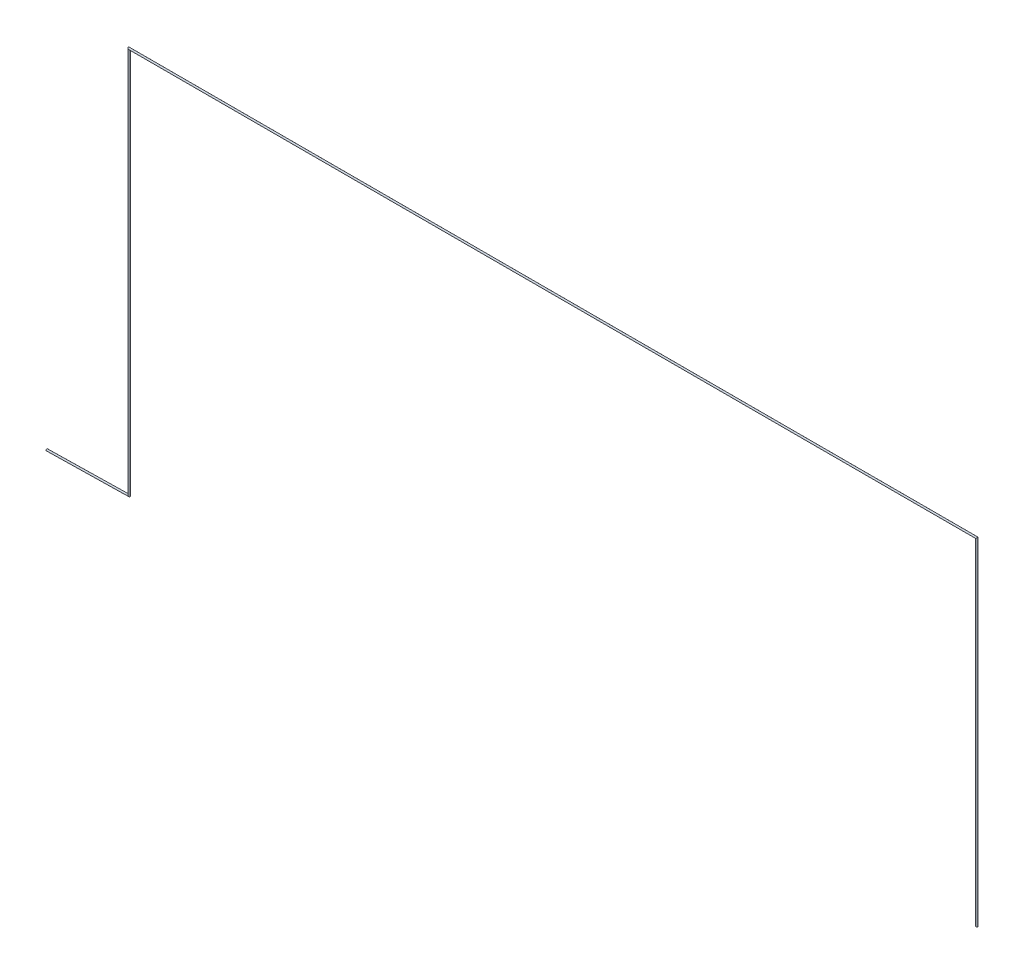
ISO-10303-21;
HEADER;
FILE_DESCRIPTION(('STEP AP214'),'2;1');
FILE_NAME('part.step','',(''),(''),'','','');
FILE_SCHEMA(('AUTOMOTIVE_DESIGN { 1 0 10303 214 1 1 1 1 }'));
ENDSEC;
DATA;
#1=APPLICATION_CONTEXT('core data for automotive mechanical design processes');
#2=APPLICATION_PROTOCOL_DEFINITION('international standard','automotive_design',2000,#1);
#3=PRODUCT_CONTEXT('',#1,'mechanical');
#4=PRODUCT('Part','Part','',(#3));
#5=PRODUCT_RELATED_PRODUCT_CATEGORY('part','',(#4));
#6=PRODUCT_DEFINITION_FORMATION('','',#4);
#7=PRODUCT_DEFINITION_CONTEXT('part definition',#1,'design');
#8=PRODUCT_DEFINITION('design','',#6,#7);
#9=PRODUCT_DEFINITION_SHAPE('','',#8);
#10=(LENGTH_UNIT() NAMED_UNIT(*) SI_UNIT(.MILLI.,.METRE.));
#11=(NAMED_UNIT(*) PLANE_ANGLE_UNIT() SI_UNIT($,.RADIAN.));
#12=(NAMED_UNIT(*) SI_UNIT($,.STERADIAN.) SOLID_ANGLE_UNIT());
#13=UNCERTAINTY_MEASURE_WITH_UNIT(LENGTH_MEASURE(1.E-05),#10,'distance_accuracy_value','');
#14=(GEOMETRIC_REPRESENTATION_CONTEXT(3) GLOBAL_UNCERTAINTY_ASSIGNED_CONTEXT((#13)) GLOBAL_UNIT_ASSIGNED_CONTEXT((#10,
#11,#12)) REPRESENTATION_CONTEXT('',''));
#15=CARTESIAN_POINT('',(0.,0.,0.));
#16=DIRECTION('',(0.,0.,1.));
#17=DIRECTION('',(1.,0.,0.));
#18=AXIS2_PLACEMENT_3D('',#15,#16,#17);
#19=CARTESIAN_POINT('',(-194.582886134953,-363.860385359744,-351.251180361304));
#20=DIRECTION('',(-4.24971293420645E-05,-0.999999999091657,-3.26803255613893E-06));
#21=DIRECTION('',(-4.00920327569539E-07,3.26804959705274E-06,-0.99999999999458));
#22=AXIS2_PLACEMENT_3D('',#19,#20,#21);
#23=PLANE('',#22);
#24=CARTESIAN_POINT('',(-194.582886134953,-363.860385359744,-351.251180361304));
#25=DIRECTION('',(-4.24971293420645E-05,-0.999999999091657,-3.26803255613893E-06));
#26=DIRECTION('',(-4.00920327569539E-07,3.26804959705274E-06,-0.99999999999458));
#27=AXIS2_PLACEMENT_3D('',#24,#25,#26);
#28=CIRCLE('',#27,0.500000000000026);
#29=CARTESIAN_POINT('',(-194.582886335413,-363.860383725719,-351.751180361302));
#30=VERTEX_POINT('',#29);
#31=EDGE_CURVE('E50',#30,#30,#28,.T.);
#32=ORIENTED_EDGE('',*,*,#31,.T.);
#33=EDGE_LOOP('',(#32));
#34=FACE_BOUND('',#33,.T.);
#35=ADVANCED_FACE('F33',(#34),#23,.T.);
#36=CARTESIAN_POINT('',(-746.966750277057,-394.63762578571,-350.993909662722));
#37=DIRECTION('',(0.999886675784921,0.0140945483878625,-0.00528954568206334));
#38=DIRECTION('',(-0.00521543390921143,-0.00528976586530986,-0.999972408432468));
#39=AXIS2_PLACEMENT_3D('',#36,#37,#38);
#40=PLANE('',#39);
#41=CARTESIAN_POINT('',(-746.966750277057,-394.63762578571,-350.993909662722));
#42=DIRECTION('',(0.999886675784921,0.0140945483878625,-0.00528954568206334));
#43=DIRECTION('',(-0.00521543390921143,-0.00528976586530986,-0.999972408432468));
#44=AXIS2_PLACEMENT_3D('',#41,#42,#43);
#45=CIRCLE('',#44,0.500000000000026);
#46=CARTESIAN_POINT('',(-746.969357994012,-394.640270668642,-351.493895866939));
#47=VERTEX_POINT('',#46);
#48=EDGE_CURVE('E44',#47,#47,#45,.T.);
#49=ORIENTED_EDGE('',*,*,#48,.F.);
#50=EDGE_LOOP('',(#49));
#51=FACE_BOUND('',#50,.T.);
#52=ADVANCED_FACE('F162',(#51),#40,.F.);
#53=CARTESIAN_POINT('',(-194.582886134953,-162.514332612936,-351.250810996714));
#54=DIRECTION('',(0.,-0.999999999998317,-1.83447644364089E-06));
#55=DIRECTION('',(0.,1.83447644364089E-06,-0.999999999998317));
#56=AXIS2_PLACEMENT_3D('',#53,#54,#55);
#57=CYLINDRICAL_SURFACE('',#56,0.499999999999494);
#58=CARTESIAN_POINT('',(-194.582886335413,-163.851461206148,-351.750813449645));
#59=CARTESIAN_POINT('',(-194.621327161349,-163.889903665742,-351.750815747025));
#60=CARTESIAN_POINT('',(-194.659805951125,-163.928384092562,-351.746398020762));
#61=CARTESIAN_POINT('',(-194.73577895391,-164.00436033124,-351.728464193516));
#62=CARTESIAN_POINT('',(-194.773271611424,-164.041854587542,-351.714934520568));
#63=CARTESIAN_POINT('',(-194.83487097047,-164.103456576999,-351.683609313382));
#64=CARTESIAN_POINT('',(-194.859615450693,-164.128202114945,-351.668316189593));
#65=CARTESIAN_POINT('',(-194.907153595954,-164.175742294818,-351.632563263343));
#66=CARTESIAN_POINT('',(-194.929951352764,-164.198541028686,-351.612114673699));
#67=CARTESIAN_POINT('',(-194.967029321579,-164.235620589438,-351.57171662836));
#68=CARTESIAN_POINT('',(-194.981985596019,-164.25057750699,-351.553011708131));
#69=CARTESIAN_POINT('',(-195.009653766166,-164.278246869228,-351.512481535774));
#70=CARTESIAN_POINT('',(-195.022366527291,-164.29096017937,-351.49065749273));
#71=CARTESIAN_POINT('',(-195.042485994702,-164.311080518606,-351.44878613327));
#72=CARTESIAN_POINT('',(-195.050445853512,-164.319040723519,-351.429273023477));
#73=CARTESIAN_POINT('',(-195.063975378596,-164.332570839853,-351.388686380421));
#74=CARTESIAN_POINT('',(-195.06955086217,-164.338146568821,-351.367616793739));
#75=CARTESIAN_POINT('',(-195.077964960568,-164.346561042199,-351.324221301893));
#76=CARTESIAN_POINT('',(-195.080782447919,-164.349378658243,-351.301887063954));
#77=CARTESIAN_POINT('',(-195.083356739622,-164.351953077396,-351.256868688799));
#78=CARTESIAN_POINT('',(-195.083114835928,-164.351711172516,-351.23418470332));
#79=CARTESIAN_POINT('',(-195.079791178422,-164.348387390776,-351.191747229649));
#80=CARTESIAN_POINT('',(-195.077020556156,-164.345616658704,-351.171942934349));
#81=CARTESIAN_POINT('',(-195.069259374028,-164.337855162272,-351.133204905193));
#82=CARTESIAN_POINT('',(-195.064265696962,-164.332861280574,-351.114272435103));
#83=CARTESIAN_POINT('',(-195.05209454404,-164.320689625386,-351.076899761952));
#84=CARTESIAN_POINT('',(-195.04483323657,-164.313428016695,-351.058514724801));
#85=CARTESIAN_POINT('',(-195.028563733967,-164.297157836777,-351.023331269982));
#86=CARTESIAN_POINT('',(-195.01955182535,-164.288145551904,-351.006536340031));
#87=CARTESIAN_POINT('',(-194.994829903467,-164.26342259565,-350.965974750861));
#88=CARTESIAN_POINT('',(-194.978145048703,-164.246737040867,-350.943392888325));
#89=CARTESIAN_POINT('',(-194.942456248142,-164.211046740071,-350.902313795859));
#90=CARTESIAN_POINT('',(-194.923449464296,-164.192039155888,-350.883821643837));
#91=CARTESIAN_POINT('',(-194.876230925052,-164.14481862578,-350.844334601472));
#92=CARTESIAN_POINT('',(-194.847284446704,-164.115870924976,-350.825099622029));
#93=CARTESIAN_POINT('',(-194.787630815401,-164.056214771217,-350.793405918146));
#94=CARTESIAN_POINT('',(-194.75692251396,-164.025505169727,-350.780951670657));
#95=CARTESIAN_POINT('',(-194.693744943855,-163.96232492225,-350.762116710129));
#96=CARTESIAN_POINT('',(-194.661250562366,-163.929829162305,-350.7559063156));
#97=CARTESIAN_POINT('',(-194.595948659862,-163.864524487002,-350.74990896543));
#98=CARTESIAN_POINT('',(-194.563140881981,-163.831715314768,-350.750127830298));
#99=CARTESIAN_POINT('',(-194.491376188383,-163.759947568282,-350.757685353283));
#100=CARTESIAN_POINT('',(-194.452488627364,-163.721058351113,-350.766425856746));
#101=CARTESIAN_POINT('',(-194.376439341692,-163.645005822586,-350.79364005735));
#102=CARTESIAN_POINT('',(-194.339274784546,-163.607839678619,-350.812097115663));
#103=CARTESIAN_POINT('',(-194.282239476867,-163.550801931676,-350.850447689843));
#104=CARTESIAN_POINT('',(-194.261244732723,-163.529806288654,-350.867017424688));
#105=CARTESIAN_POINT('',(-194.221255439245,-163.489815280705,-350.904444373296));
#106=CARTESIAN_POINT('',(-194.202257609556,-163.470816635287,-350.925294383952));
#107=CARTESIAN_POINT('',(-194.171173880588,-163.439731568915,-350.966216757465));
#108=CARTESIAN_POINT('',(-194.158498250623,-163.427055392573,-350.98538955309));
#109=CARTESIAN_POINT('',(-194.135488213568,-163.404044361215,-351.026348497272));
#110=CARTESIAN_POINT('',(-194.125148657576,-163.39370435708,-351.048128733325));
#111=CARTESIAN_POINT('',(-194.109057898574,-163.377612897507,-351.08989675965));
#112=CARTESIAN_POINT('',(-194.102816274094,-163.371370999909,-351.109504837172));
#113=CARTESIAN_POINT('',(-194.092736803281,-163.361291084547,-351.149891624209));
#114=CARTESIAN_POINT('',(-194.088893666948,-163.357447776558,-351.170667646555));
#115=CARTESIAN_POINT('',(-194.083862981662,-163.352416860516,-351.212974453687));
#116=CARTESIAN_POINT('',(-194.082689377068,-163.351243197413,-351.234508607725));
#117=CARTESIAN_POINT('',(-194.083136989062,-163.351690811187,-351.277517790205));
#118=CARTESIAN_POINT('',(-194.084758046873,-163.353311929279,-351.298992821937));
#119=CARTESIAN_POINT('',(-194.090450778084,-163.359004886101,-351.339695048044));
#120=CARTESIAN_POINT('',(-194.094341671754,-163.362895937398,-351.358973991986));
#121=CARTESIAN_POINT('',(-194.104176466022,-163.372731134596,-351.396460990631));
#122=CARTESIAN_POINT('',(-194.110122528277,-163.378677442248,-351.414667894052));
#123=CARTESIAN_POINT('',(-194.126085473846,-163.394641049771,-351.455672478841));
#124=CARTESIAN_POINT('',(-194.136799066273,-163.405355088582,-351.477927736739));
#125=CARTESIAN_POINT('',(-194.16063903246,-163.429196051182,-351.519677180566));
#126=CARTESIAN_POINT('',(-194.173769680099,-163.442327249034,-351.539166365636));
#127=CARTESIAN_POINT('',(-194.206941253574,-163.475500215089,-351.581933221504));
#128=CARTESIAN_POINT('',(-194.227757122751,-163.496316960051,-351.604005152635));
#129=CARTESIAN_POINT('',(-194.27160052373,-163.540162208573,-351.643201881038));
#130=CARTESIAN_POINT('',(-194.294632715334,-163.563195372139,-351.66031593769));
#131=CARTESIAN_POINT('',(-194.350665566675,-163.619230590761,-351.695246951324));
#132=CARTESIAN_POINT('',(-194.384274608432,-163.652841054478,-351.711107248154));
#133=CARTESIAN_POINT('',(-194.452779223413,-163.721348571212,-351.734947018551));
#134=CARTESIAN_POINT('',(-194.487673045972,-163.756243873486,-351.742936832295));
#135=CARTESIAN_POINT('',(-194.542757597136,-163.811330762962,-351.749606253024));
#136=CARTESIAN_POINT('',(-194.562816792236,-163.831390810054,-351.750812250207));
#137=CARTESIAN_POINT('',(-194.582886335413,-163.851461206148,-351.750813449645));
#138=B_SPLINE_CURVE_WITH_KNOTS('',3,(#58,#59,#60,#61,#62,#63,#64,#65,#66,#67,#68,#69,#70,#71,
#72,#73,#74,#75,#76,#77,#78,#79,#80,#81,#82,#83,#84,#85,#86,#87,#88,#89,#90,#91,#92,#93,#94,#95,
#96,#97,#98,#99,#100,#101,#102,#103,#104,#105,#106,#107,#108,#109,#110,#111,#112,#113,#114,#115,
#116,#117,#118,#119,#120,#121,#122,#123,#124,#125,#126,#127,#128,#129,#130,#131,#132,#133,#134,
#135,#136,#137),.UNSPECIFIED.,.T.,.F.,(4,2,2,2,2,2,2,2,2,2,2,2,2,2,2,2,2,2,2,2,2,2,2,2,2,2,2,2,
2,2,2,2,2,2,2,2,2,2,2,4),(0.,0.163014853139949,0.326273050495085,0.440488144662774,
0.554456939339665,0.638884121527422,0.723278665016467,0.790594412783994,0.857744976183851,
0.92540600830885,0.993038468703889,1.05332906449677,1.11370446837037,1.17664719955085,
1.23972493634363,1.33715707206923,1.43470951163321,1.56967355096757,1.70472659203448,
1.84337104887548,1.98214102660728,2.14840140303064,2.31437799344587,2.41608389400753,
2.51762002050646,2.59608743565547,2.67438017723352,2.73862337216958,2.80272436965697,
2.86715943867024,2.93159084694963,2.99148094076668,3.05143422055847,3.13176060460922,
3.21223041184357,3.3220106373085,3.43202693935455,3.58157065268769,3.73091763361943,
3.81602594110265),.UNSPECIFIED.);
#139=CARTESIAN_POINT('',(-194.582886335413,-163.851461206148,-351.750813449645));
#140=VERTEX_POINT('',#139);
#141=EDGE_CURVE('E55',#140,#140,#138,.T.);
#142=ORIENTED_EDGE('',*,*,#141,.F.);
#143=EDGE_LOOP('',(#142));
#144=FACE_BOUND('',#143,.T.);
#145=ORIENTED_EDGE('',*,*,#31,.F.);
#146=EDGE_LOOP('',(#145));
#147=FACE_BOUND('',#146,.T.);
#148=ADVANCED_FACE('F157',(#144,#147),#57,.T.);
#149=CARTESIAN_POINT('',(-699.660326631315,-163.872925547185,-351.251537515104));
#150=DIRECTION('',(0.99999999909597,4.24971287673706E-05,1.43357315355729E-06));
#151=DIRECTION('',(-4.24971287674142E-05,0.999999999096997,0.));
#152=AXIS2_PLACEMENT_3D('',#149,#150,#151);
#153=CYLINDRICAL_SURFACE('',#152,0.499999999999487);
#154=CARTESIAN_POINT('',(-698.323304971189,-163.872868727603,-351.751535598386));
#155=CARTESIAN_POINT('',(-698.284865774037,-163.911306291234,-351.751537784436));
#156=CARTESIAN_POINT('',(-698.246388599861,-163.949781829814,-351.747120315116));
#157=CARTESIAN_POINT('',(-698.170418786832,-164.025748412541,-351.72918782631));
#158=CARTESIAN_POINT('',(-698.132927704091,-164.063237900641,-351.715659230445));
#159=CARTESIAN_POINT('',(-698.071328909092,-164.124834074653,-351.684335797829));
#160=CARTESIAN_POINT('',(-698.046583561997,-164.149578368568,-351.669042722909));
#161=CARTESIAN_POINT('',(-697.999043831772,-164.197116074801,-351.633289777831));
#162=CARTESIAN_POINT('',(-697.976245356512,-164.219913579077,-351.612841120861));
#163=CARTESIAN_POINT('',(-697.939166055235,-164.256991300407,-351.572442704596));
#164=CARTESIAN_POINT('',(-697.924209151645,-164.271947566432,-351.553737435338));
#165=CARTESIAN_POINT('',(-697.896539886173,-164.299615651833,-351.513206536515));
#166=CARTESIAN_POINT('',(-697.883826659133,-164.312328336331,-351.491382115591));
#167=CARTESIAN_POINT('',(-697.863706302498,-164.332447833555,-351.449509703614));
#168=CARTESIAN_POINT('',(-697.855746033665,-164.34040776207,-351.429995870646));
#169=CARTESIAN_POINT('',(-697.84221588852,-164.353937327998,-351.389407769515));
#170=CARTESIAN_POINT('',(-697.836640194624,-164.359512782748,-351.36833744782));
#171=CARTESIAN_POINT('',(-697.828225875309,-164.367926739956,-351.324940523566));
#172=CARTESIAN_POINT('',(-697.825408376584,-164.370744116616,-351.302605589325));
#173=CARTESIAN_POINT('',(-697.82283424452,-164.373318134589,-351.257585864051));
#174=CARTESIAN_POINT('',(-697.823076319393,-164.373076067636,-351.234901224709));
#175=CARTESIAN_POINT('',(-697.826400481401,-164.369752042461,-351.192462331672));
#176=CARTESIAN_POINT('',(-697.829171446152,-164.366981193399,-351.172657270849));
#177=CARTESIAN_POINT('',(-697.836933494257,-164.359219471108,-351.13391777311));
#178=CARTESIAN_POINT('',(-697.841927695027,-164.354225480595,-351.114984600032));
#179=CARTESIAN_POINT('',(-697.854100080417,-164.342053608585,-351.077610597813));
#180=CARTESIAN_POINT('',(-697.861362101569,-164.334791894122,-351.059224936731));
#181=CARTESIAN_POINT('',(-697.877633188148,-164.318521495329,-351.024040344582));
#182=CARTESIAN_POINT('',(-697.886645967417,-164.309509097316,-351.007244901492));
#183=CARTESIAN_POINT('',(-697.911369751843,-164.284786359323,-350.96668303293));
#184=CARTESIAN_POINT('',(-697.92805557393,-164.268101243963,-350.944101354422));
#185=CARTESIAN_POINT('',(-697.963746401478,-164.232411928852,-350.903022726671));
#186=CARTESIAN_POINT('',(-697.982754244452,-164.21340489171,-350.884530854276));
#187=CARTESIAN_POINT('',(-698.029974288107,-164.166186850606,-350.845045591294));
#188=CARTESIAN_POINT('',(-698.0589211225,-164.137241244337,-350.825811882071));
#189=CARTESIAN_POINT('',(-698.118575434317,-164.077589464294,-350.794120590649));
#190=CARTESIAN_POINT('',(-698.149284060036,-164.046882142276,-350.781667484643));
#191=CARTESIAN_POINT('',(-698.212461994053,-163.983706891116,-350.762834900012));
#192=CARTESIAN_POINT('',(-698.244956406356,-163.951213859055,-350.756625687737));
#193=CARTESIAN_POINT('',(-698.310258281248,-163.885914758621,-350.75063066322));
#194=CARTESIAN_POINT('',(-698.343066000601,-163.853108433495,-350.750850670942));
#195=CARTESIAN_POINT('',(-698.414829054617,-163.781348429927,-350.758410555375));
#196=CARTESIAN_POINT('',(-698.453715019909,-163.742464118055,-350.767151955328));
#197=CARTESIAN_POINT('',(-698.529760956374,-163.666421416095,-350.794367204936));
#198=CARTESIAN_POINT('',(-698.566923760113,-163.629260193562,-350.812824418275));
#199=CARTESIAN_POINT('',(-698.623957330349,-163.572229051041,-350.851175152203));
#200=CARTESIAN_POINT('',(-698.644952039731,-163.551235235585,-350.867745435429));
#201=CARTESIAN_POINT('',(-698.684941057015,-163.51124792159,-350.905173408588));
#202=CARTESIAN_POINT('',(-698.703938645638,-163.492251142469,-350.92602389548));
#203=CARTESIAN_POINT('',(-698.735021970237,-163.461169143067,-350.966947203944));
#204=CARTESIAN_POINT('',(-698.747697452644,-163.448494201322,-350.98612054369));
#205=CARTESIAN_POINT('',(-698.770707012547,-163.425485623514,-351.027080442974));
#206=CARTESIAN_POINT('',(-698.781046238819,-163.415146838894,-351.048861090933));
#207=CARTESIAN_POINT('',(-698.797136497551,-163.399057268298,-351.090630256765));
#208=CARTESIAN_POINT('',(-698.803377910771,-163.392816122361,-351.110239148225));
#209=CARTESIAN_POINT('',(-698.813456752108,-163.382737713554,-351.150627443582));
#210=CARTESIAN_POINT('',(-698.817299470305,-163.378895160827,-351.171404160771));
#211=CARTESIAN_POINT('',(-698.822329146982,-163.373865702308,-351.213712168592));
#212=CARTESIAN_POINT('',(-698.823502163751,-163.372692737636,-351.235246826765));
#213=CARTESIAN_POINT('',(-698.823053269549,-163.373141617252,-351.27825685294));
#214=CARTESIAN_POINT('',(-698.821431517039,-163.374763303086,-351.299732224233));
#215=CARTESIAN_POINT('',(-698.815737320587,-163.380457261805,-351.340435402429));
#216=CARTESIAN_POINT('',(-698.811845611604,-163.384348807417,-351.359714953554));
#217=CARTESIAN_POINT('',(-698.802009058339,-163.39418494658,-351.397203028306));
#218=CARTESIAN_POINT('',(-698.796062052274,-163.400131701819,-351.415410400511));
#219=CARTESIAN_POINT('',(-698.780096780571,-163.41609629934,-351.456415910958));
#220=CARTESIAN_POINT('',(-698.769381765816,-163.426810861071,-351.478671574149));
#221=CARTESIAN_POINT('',(-698.745538811076,-163.450652806934,-351.520421590712));
#222=CARTESIAN_POINT('',(-698.732406597152,-163.463784464822,-351.539910943028));
#223=CARTESIAN_POINT('',(-698.699231718831,-163.496957937801,-351.582677221724));
#224=CARTESIAN_POINT('',(-698.678414156257,-163.517774618011,-351.6047484457));
#225=CARTESIAN_POINT('',(-698.634567339174,-163.561619575862,-351.643943534418));
#226=CARTESIAN_POINT('',(-698.611533425014,-163.584652512954,-351.661056658549));
#227=CARTESIAN_POINT('',(-698.555498138861,-163.640685421464,-351.695984115792));
#228=CARTESIAN_POINT('',(-698.521888517793,-163.674293615906,-351.711842098325));
#229=CARTESIAN_POINT('',(-698.453382924684,-163.742796300275,-351.735677353992));
#230=CARTESIAN_POINT('',(-698.41848870394,-163.77768903898,-351.743664972114));
#231=CARTESIAN_POINT('',(-698.363413747856,-163.832761655282,-351.750329715711));
#232=CARTESIAN_POINT('',(-698.343364530648,-163.852810020599,-351.751534457592));
#233=CARTESIAN_POINT('',(-698.323304971189,-163.872868727603,-351.751535598386));
#234=B_SPLINE_CURVE_WITH_KNOTS('',3,(#154,#155,#156,#157,#158,#159,#160,#161,#162,#163,#164,
#165,#166,#167,#168,#169,#170,#171,#172,#173,#174,#175,#176,#177,#178,#179,#180,#181,#182,#183,
#184,#185,#186,#187,#188,#189,#190,#191,#192,#193,#194,#195,#196,#197,#198,#199,#200,#201,#202,
#203,#204,#205,#206,#207,#208,#209,#210,#211,#212,#213,#214,#215,#216,#217,#218,#219,#220,#221,
#222,#223,#224,#225,#226,#227,#228,#229,#230,#231,#232,#233),.UNSPECIFIED.,.T.,.F.,(4,2,2,2,2,2,
2,2,2,2,2,2,2,2,2,2,2,2,2,2,2,2,2,2,2,2,2,2,2,2,2,2,2,2,2,2,2,2,2,4),(0.,0.163001065000885,
0.326245554877805,0.440459824477915,0.554427793755296,0.638855618998272,0.723250817511213,
0.790568571631552,0.857721142361842,0.925384142185704,0.99301857486681,1.05331160177168,
1.11368943902131,1.17663463826703,1.23971484922718,1.33714741551019,1.43470025841494,
1.56965937436239,1.70470747544153,1.84334578179984,1.98210959250034,2.14835681364044,
2.31432029245682,2.41602352581233,2.51755698832777,2.59602358240233,2.67431552302559,
2.73856009136693,2.80266246947355,2.86709884227829,2.93153156172041,2.99142416251943,
3.05137995165068,3.13170964692512,3.21218276479783,3.32196447997886,3.43198226425561,
3.58152043109098,3.73086177823905,3.81592415720555),.UNSPECIFIED.);
#235=CARTESIAN_POINT('',(-698.323304971189,-163.872868727603,-351.751535598386));
#236=VERTEX_POINT('',#235);
#237=EDGE_CURVE('E103',#236,#236,#234,.T.);
#238=ORIENTED_EDGE('',*,*,#237,.F.);
#239=EDGE_LOOP('',(#238));
#240=FACE_BOUND('',#239,.T.);
#241=ORIENTED_EDGE('',*,*,#141,.T.);
#242=EDGE_LOOP('',(#241));
#243=FACE_BOUND('',#242,.T.);
#244=ADVANCED_FACE('F89',(#240,#243),#153,.T.);
#245=CARTESIAN_POINT('',(-698.323304918992,-395.300769617021,-351.2511796689));
#246=DIRECTION('',(0.,0.999999999998817,-1.53797137070804E-06));
#247=DIRECTION('',(0.,1.53797137070804E-06,0.999999999998817));
#248=AXIS2_PLACEMENT_3D('',#245,#246,#247);
#249=CYLINDRICAL_SURFACE('',#248,0.499999999999484);
#250=CARTESIAN_POINT('',(-698.323304971188,-393.952480717345,-351.75118174253));
#251=CARTESIAN_POINT('',(-698.285193173416,-393.990056966822,-351.751183740472));
#252=CARTESIAN_POINT('',(-698.247029524597,-394.027661671498,-351.746840138353));
#253=CARTESIAN_POINT('',(-698.171653300531,-394.101886678767,-351.729201224395));
#254=CARTESIAN_POINT('',(-698.134442294731,-394.138505361491,-351.715892017791));
#255=CARTESIAN_POINT('',(-698.073037209089,-394.198886284282,-351.684972610819));
#256=CARTESIAN_POINT('',(-698.048231253812,-394.223264388825,-351.669775559185));
#257=CARTESIAN_POINT('',(-698.000568501449,-394.270071932045,-351.634224790113));
#258=CARTESIAN_POINT('',(-697.977707629227,-394.292505446777,-351.613882227237));
#259=CARTESIAN_POINT('',(-697.940448454708,-394.329031043977,-351.573622516553));
#260=CARTESIAN_POINT('',(-697.925382147188,-394.343788133828,-351.554930256618));
#261=CARTESIAN_POINT('',(-697.897506639912,-394.371060656885,-351.514427247667));
#262=CARTESIAN_POINT('',(-697.884696625116,-394.383576899578,-351.492617629911));
#263=CARTESIAN_POINT('',(-697.864368507019,-394.403400701719,-351.450697866058));
#264=CARTESIAN_POINT('',(-697.856304677735,-394.4112490457,-351.431110571311));
#265=CARTESIAN_POINT('',(-697.842592233618,-394.424556319481,-351.390375618672));
#266=CARTESIAN_POINT('',(-697.836937796997,-394.430021009644,-351.369231868426));
#267=CARTESIAN_POINT('',(-697.82838865585,-394.43822294474,-351.325699433631));
#268=CARTESIAN_POINT('',(-697.825514578966,-394.440939810062,-351.303302728523));
#269=CARTESIAN_POINT('',(-697.822843595348,-394.443337821409,-351.258166058365));
#270=CARTESIAN_POINT('',(-697.823045489524,-394.443020150389,-351.235426230526));
#271=CARTESIAN_POINT('',(-697.826312596787,-394.439576671526,-351.192811887722));
#272=CARTESIAN_POINT('',(-697.829073903821,-394.43675024111,-351.172887902527));
#273=CARTESIAN_POINT('',(-697.836844000115,-394.428886045279,-351.133915085369));
#274=CARTESIAN_POINT('',(-697.841855951321,-394.423845168991,-351.114867526352));
#275=CARTESIAN_POINT('',(-697.854101728972,-394.411575174404,-351.077234581279));
#276=CARTESIAN_POINT('',(-697.861424021265,-394.404259134383,-351.058706896296));
#277=CARTESIAN_POINT('',(-697.877847996605,-394.387881021303,-351.023252936948));
#278=CARTESIAN_POINT('',(-697.886953471159,-394.37881522842,-351.006330190937));
#279=CARTESIAN_POINT('',(-697.911883538367,-394.354022907148,-350.965576030106));
#280=CARTESIAN_POINT('',(-697.928687945532,-394.337336486148,-350.942924272034));
#281=CARTESIAN_POINT('',(-697.964652615928,-394.301662305929,-350.90172583552));
#282=CARTESIAN_POINT('',(-697.983815657624,-394.282671832927,-350.883184072032));
#283=CARTESIAN_POINT('',(-698.031252916078,-394.235695616345,-350.843775344111));
#284=CARTESIAN_POINT('',(-698.060254781742,-394.207001435226,-350.824631154722));
#285=CARTESIAN_POINT('',(-698.120044275956,-394.147887706413,-350.793110669674));
#286=CARTESIAN_POINT('',(-698.150833025233,-394.117467076166,-350.780738673378));
#287=CARTESIAN_POINT('',(-698.214148092422,-394.054944513244,-350.762100615483));
#288=CARTESIAN_POINT('',(-698.24669863215,-394.022819540314,-350.755995820911));
#289=CARTESIAN_POINT('',(-698.312123580796,-393.958283879219,-350.750228333048));
#290=CARTESIAN_POINT('',(-698.344998257919,-393.925872957278,-350.750571517859));
#291=CARTESIAN_POINT('',(-698.416616736637,-393.855301756487,-350.758407404561));
#292=CARTESIAN_POINT('',(-698.455293924513,-393.817214148388,-350.767240776279));
#293=CARTESIAN_POINT('',(-698.53091980439,-393.742793459587,-350.794554684511));
#294=CARTESIAN_POINT('',(-698.5678713954,-393.706457432644,-350.81301835644));
#295=CARTESIAN_POINT('',(-698.624630265094,-393.650695995729,-350.85133021308));
#296=CARTESIAN_POINT('',(-698.645558120046,-393.63014868,-350.867904674187));
#297=CARTESIAN_POINT('',(-698.685401610267,-393.591060173439,-350.905306086124));
#298=CARTESIAN_POINT('',(-698.704320539627,-393.572515697614,-350.926125906704));
#299=CARTESIAN_POINT('',(-698.735319002966,-393.542166151291,-350.967021555537));
#300=CARTESIAN_POINT('',(-698.747981736725,-393.52978150893,-350.986221756695));
#301=CARTESIAN_POINT('',(-698.770948076758,-393.507351686608,-351.027207618953));
#302=CARTESIAN_POINT('',(-698.781256765658,-393.497301465567,-351.048987552611));
#303=CARTESIAN_POINT('',(-698.797326153477,-393.481676117219,-351.090824592747));
#304=CARTESIAN_POINT('',(-698.803566708345,-393.475625981499,-351.110518298419));
#305=CARTESIAN_POINT('',(-698.813627164736,-393.465918494103,-351.151084066639));
#306=CARTESIAN_POINT('',(-698.817448658252,-393.462259568711,-351.17195534435));
#307=CARTESIAN_POINT('',(-698.822409447766,-393.457589894687,-351.214401545485));
#308=CARTESIAN_POINT('',(-698.823537603348,-393.456590143222,-351.235979018526));
#309=CARTESIAN_POINT('',(-698.822992060211,-393.457352676584,-351.279048558419));
#310=CARTESIAN_POINT('',(-698.821318429496,-393.459114894374,-351.300540627331));
#311=CARTESIAN_POINT('',(-698.815508290638,-393.465056347367,-351.341367821558));
#312=CARTESIAN_POINT('',(-698.811540061055,-393.469069924969,-351.360752074252));
#313=CARTESIAN_POINT('',(-698.801529401191,-393.479136452705,-351.398431485197));
#314=CARTESIAN_POINT('',(-698.795484738045,-393.48519159808,-351.416725446064));
#315=CARTESIAN_POINT('',(-698.779246447074,-393.501416859041,-351.457973538113));
#316=CARTESIAN_POINT('',(-698.768340872721,-393.512286021322,-351.480372594896));
#317=CARTESIAN_POINT('',(-698.74407767672,-393.536427313563,-351.522367348941));
#318=CARTESIAN_POINT('',(-698.730715718045,-393.549703693163,-351.54195797697));
#319=CARTESIAN_POINT('',(-698.697039116898,-393.583130588984,-351.584811317687));
#320=CARTESIAN_POINT('',(-698.675949701839,-393.604038714468,-351.60687084362));
#321=CARTESIAN_POINT('',(-698.631530480727,-393.648037813183,-351.645993743995));
#322=CARTESIAN_POINT('',(-698.608195993707,-393.671133345517,-351.663046365624));
#323=CARTESIAN_POINT('',(-698.551728808418,-393.726987137617,-351.697574080333));
#324=CARTESIAN_POINT('',(-698.51800358828,-393.760319668123,-351.713146454541));
#325=CARTESIAN_POINT('',(-698.449266385509,-393.828212309843,-351.736411837704));
#326=CARTESIAN_POINT('',(-698.41425631453,-393.862770594951,-351.744116097137));
#327=CARTESIAN_POINT('',(-698.360512310092,-393.915790812625,-351.750143655567));
#328=CARTESIAN_POINT('',(-698.341914822149,-393.934132372651,-351.751180766942));
#329=CARTESIAN_POINT('',(-698.323304971188,-393.952480717345,-351.75118174253));
#330=B_SPLINE_CURVE_WITH_KNOTS('',3,(#250,#251,#252,#253,#254,#255,#256,#257,#258,#259,#260,
#261,#262,#263,#264,#265,#266,#267,#268,#269,#270,#271,#272,#273,#274,#275,#276,#277,#278,#279,
#280,#281,#282,#283,#284,#285,#286,#287,#288,#289,#290,#291,#292,#293,#294,#295,#296,#297,#298,
#299,#300,#301,#302,#303,#304,#305,#306,#307,#308,#309,#310,#311,#312,#313,#314,#315,#316,#317,
#318,#319,#320,#321,#322,#323,#324,#325,#326,#327,#328,#329),.UNSPECIFIED.,.T.,.F.,(4,2,2,2,2,2,
2,2,2,2,2,2,2,2,2,2,2,2,2,2,2,2,2,2,2,2,2,2,2,2,2,2,2,2,2,2,2,2,2,4),(0.,0.160491162479197,
0.321231625820939,0.434737433885913,0.547999259176051,0.63225898425703,0.716488209535646,
0.783987667947898,0.851323090354372,0.919154331563642,0.986959131163026,1.04762035307792,
1.10836706625451,1.17180050919855,1.2353703218699,1.33313131542974,1.43100859360799,
1.56548224296115,1.70004116489054,1.83798178780234,1.97604816613857,2.14024193622199,
2.30414913076946,2.40491100646086,2.50550502222951,2.58359381915741,2.66151238567022,
2.72582316996348,2.79009158696461,2.85462537942522,2.91915760557097,2.97946826935667,
3.0398439914326,3.12093812262095,3.20217683440929,3.31255369554676,3.42316589634386,
3.57212200552442,3.72086482549501,3.79923207103832),.UNSPECIFIED.);
#331=CARTESIAN_POINT('',(-698.323304971189,-393.952480717344,-351.75118174253));
#332=VERTEX_POINT('',#331);
#333=EDGE_CURVE('E11',#332,#332,#330,.T.);
#334=ORIENTED_EDGE('',*,*,#333,.F.);
#335=EDGE_LOOP('',(#334));
#336=FACE_BOUND('',#335,.T.);
#337=ORIENTED_EDGE('',*,*,#237,.T.);
#338=EDGE_LOOP('',(#337));
#339=FACE_BOUND('',#338,.T.);
#340=ADVANCED_FACE('F67',(#336,#339),#249,.T.);
#341=CARTESIAN_POINT('',(-746.966750993762,-394.637625795843,-350.993909658932));
#342=DIRECTION('',(0.999886082207299,0.0141370482711511,-0.00528833379413895));
#343=DIRECTION('',(-0.0141372459569963,0.999900064144788,0.));
#344=AXIS2_PLACEMENT_3D('',#341,#342,#343);
#345=CYLINDRICAL_SURFACE('',#344,0.499999999999488);
#346=ORIENTED_EDGE('',*,*,#48,.T.);
#347=EDGE_LOOP('',(#346));
#348=FACE_BOUND('',#347,.T.);
#349=ORIENTED_EDGE('',*,*,#333,.T.);
#350=EDGE_LOOP('',(#349));
#351=FACE_BOUND('',#350,.T.);
#352=ADVANCED_FACE('F35',(#348,#351),#345,.T.);
#353=CLOSED_SHELL('',(#35,#52,#148,#244,#340,#352));
#354=MANIFOLD_SOLID_BREP('B2',#353);
#355=ADVANCED_BREP_SHAPE_REPRESENTATION('',(#18,#354),#14);
#356=SHAPE_DEFINITION_REPRESENTATION(#9,#355);
ENDSEC;
END-ISO-10303-21;
